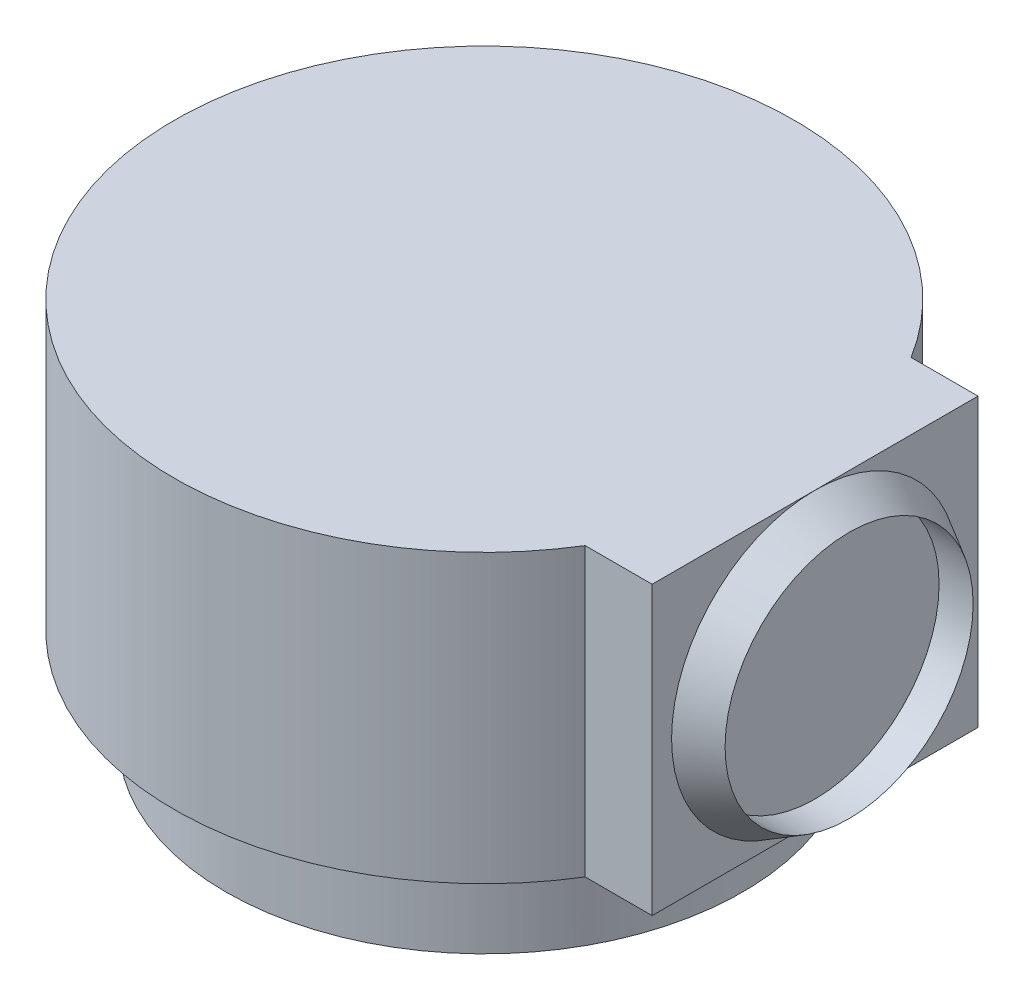
ISO-10303-21;
HEADER;
FILE_DESCRIPTION(('STEP AP214'),'2;1');
FILE_NAME('part.step','',(''),(''),'','','');
FILE_SCHEMA(('AUTOMOTIVE_DESIGN { 1 0 10303 214 1 1 1 1 }'));
ENDSEC;
DATA;
#1=APPLICATION_CONTEXT('core data for automotive mechanical design processes');
#2=APPLICATION_PROTOCOL_DEFINITION('international standard','automotive_design',2000,#1);
#3=PRODUCT_CONTEXT('',#1,'mechanical');
#4=PRODUCT('Part','Part','',(#3));
#5=PRODUCT_RELATED_PRODUCT_CATEGORY('part','',(#4));
#6=PRODUCT_DEFINITION_FORMATION('','',#4);
#7=PRODUCT_DEFINITION_CONTEXT('part definition',#1,'design');
#8=PRODUCT_DEFINITION('design','',#6,#7);
#9=PRODUCT_DEFINITION_SHAPE('','',#8);
#10=(LENGTH_UNIT() NAMED_UNIT(*) SI_UNIT(.MILLI.,.METRE.));
#11=(NAMED_UNIT(*) PLANE_ANGLE_UNIT() SI_UNIT($,.RADIAN.));
#12=(NAMED_UNIT(*) SI_UNIT($,.STERADIAN.) SOLID_ANGLE_UNIT());
#13=UNCERTAINTY_MEASURE_WITH_UNIT(LENGTH_MEASURE(1.E-05),#10,'distance_accuracy_value','');
#14=(GEOMETRIC_REPRESENTATION_CONTEXT(3) GLOBAL_UNCERTAINTY_ASSIGNED_CONTEXT((#13)) GLOBAL_UNIT_ASSIGNED_CONTEXT((#10,
#11,#12)) REPRESENTATION_CONTEXT('',''));
#15=CARTESIAN_POINT('',(0.,0.,0.));
#16=DIRECTION('',(0.,0.,1.));
#17=DIRECTION('',(1.,0.,0.));
#18=AXIS2_PLACEMENT_3D('',#15,#16,#17);
#19=CARTESIAN_POINT('',(170.,0.,0.));
#20=DIRECTION('',(1.,0.,0.));
#21=DIRECTION('',(0.,0.,-1.));
#22=AXIS2_PLACEMENT_3D('',#19,#20,#21);
#23=PLANE('',#22);
#24=DIRECTION('',(0.,0.,1.));
#25=VECTOR('',#24,1.);
#26=CARTESIAN_POINT('',(170.,147.5,-83.75));
#27=LINE('',#26,#25);
#28=CARTESIAN_POINT('',(170.,147.5,-83.75));
#29=VERTEX_POINT('',#28);
#30=CARTESIAN_POINT('',(170.,147.5,0.));
#31=VERTEX_POINT('',#30);
#32=EDGE_CURVE('E94',#29,#31,#27,.T.);
#33=ORIENTED_EDGE('',*,*,#32,.T.);
#34=CARTESIAN_POINT('',(170.,73.75,0.));
#35=DIRECTION('',(-1.,0.,0.));
#36=DIRECTION('',(0.,0.,1.));
#37=AXIS2_PLACEMENT_3D('',#34,#35,#36);
#38=CIRCLE('',#37,73.75);
#39=CARTESIAN_POINT('',(170.,0.,0.));
#40=VERTEX_POINT('',#39);
#41=EDGE_CURVE('E52',#31,#40,#38,.T.);
#42=ORIENTED_EDGE('',*,*,#41,.T.);
#43=DIRECTION('',(0.,0.,-1.));
#44=VECTOR('',#43,1.);
#45=CARTESIAN_POINT('',(170.,0.,83.75));
#46=LINE('',#45,#44);
#47=CARTESIAN_POINT('',(170.,0.,-83.75));
#48=VERTEX_POINT('',#47);
#49=EDGE_CURVE('E91',#40,#48,#46,.T.);
#50=ORIENTED_EDGE('',*,*,#49,.T.);
#51=DIRECTION('',(0.,1.,0.));
#52=VECTOR('',#51,1.);
#53=CARTESIAN_POINT('',(170.,0.,-83.75));
#54=LINE('',#53,#52);
#55=EDGE_CURVE('E111',#48,#29,#54,.T.);
#56=ORIENTED_EDGE('',*,*,#55,.T.);
#57=EDGE_LOOP('',(#33,#42,#50,#56));
#58=FACE_BOUND('',#57,.T.);
#59=ADVANCED_FACE('F38',(#58),#23,.T.);
#60=CARTESIAN_POINT('',(0.,147.5,0.));
#61=DIRECTION('',(0.,-1.,0.));
#62=DIRECTION('',(0.,0.,-1.));
#63=AXIS2_PLACEMENT_3D('',#60,#61,#62);
#64=CYLINDRICAL_SURFACE('',#63,159.375);
#65=DIRECTION('',(0.,-1.,0.));
#66=VECTOR('',#65,1.);
#67=CARTESIAN_POINT('',(135.596195097798,147.5,83.75));
#68=LINE('',#67,#66);
#69=CARTESIAN_POINT('',(135.596195097798,147.5,83.75));
#70=VERTEX_POINT('',#69);
#71=CARTESIAN_POINT('',(135.596195097798,0.,83.75));
#72=VERTEX_POINT('',#71);
#73=EDGE_CURVE('E60',#70,#72,#68,.T.);
#74=ORIENTED_EDGE('',*,*,#73,.F.);
#75=CARTESIAN_POINT('',(0.,147.5,0.));
#76=DIRECTION('',(0.,1.,0.));
#77=DIRECTION('',(0.,0.,1.));
#78=AXIS2_PLACEMENT_3D('',#75,#76,#77);
#79=CIRCLE('',#78,159.375);
#80=CARTESIAN_POINT('',(135.596195097798,147.5,-83.75));
#81=VERTEX_POINT('',#80);
#82=EDGE_CURVE('E130',#81,#70,#79,.T.);
#83=ORIENTED_EDGE('',*,*,#82,.F.);
#84=DIRECTION('',(0.,-1.,0.));
#85=VECTOR('',#84,1.);
#86=CARTESIAN_POINT('',(135.596195097798,147.5,-83.75));
#87=LINE('',#86,#85);
#88=CARTESIAN_POINT('',(135.596195097798,0.,-83.75));
#89=VERTEX_POINT('',#88);
#90=EDGE_CURVE('E125',#89,#81,#87,.F.);
#91=ORIENTED_EDGE('',*,*,#90,.F.);
#92=CARTESIAN_POINT('',(0.,0.,0.));
#93=DIRECTION('',(0.,1.,0.));
#94=DIRECTION('',(0.,0.,1.));
#95=AXIS2_PLACEMENT_3D('',#92,#93,#94);
#96=CIRCLE('',#95,159.375);
#97=EDGE_CURVE('E129',#89,#72,#96,.T.);
#98=ORIENTED_EDGE('',*,*,#97,.T.);
#99=EDGE_LOOP('',(#74,#83,#91,#98));
#100=FACE_BOUND('',#99,.T.);
#101=ADVANCED_FACE('F40',(#100),#64,.T.);
#102=CARTESIAN_POINT('',(0.,147.5,0.));
#103=DIRECTION('',(0.,1.,0.));
#104=DIRECTION('',(0.,0.,1.));
#105=AXIS2_PLACEMENT_3D('',#102,#103,#104);
#106=PLANE('',#105);
#107=ORIENTED_EDGE('',*,*,#82,.T.);
#108=DIRECTION('',(-1.,0.,0.));
#109=VECTOR('',#108,1.);
#110=CARTESIAN_POINT('',(170.,147.5,83.75));
#111=LINE('',#110,#109);
#112=CARTESIAN_POINT('',(170.,147.5,83.75));
#113=VERTEX_POINT('',#112);
#114=EDGE_CURVE('E122',#113,#70,#111,.T.);
#115=ORIENTED_EDGE('',*,*,#114,.F.);
#116=EDGE_CURVE('E95',#31,#113,#27,.T.);
#117=ORIENTED_EDGE('',*,*,#116,.F.);
#118=ORIENTED_EDGE('',*,*,#32,.F.);
#119=DIRECTION('',(-1.,0.,0.));
#120=VECTOR('',#119,1.);
#121=CARTESIAN_POINT('',(170.,147.5,-83.75));
#122=LINE('',#121,#120);
#123=EDGE_CURVE('E112',#29,#81,#122,.T.);
#124=ORIENTED_EDGE('',*,*,#123,.T.);
#125=EDGE_LOOP('',(#107,#115,#117,#118,#124));
#126=FACE_BOUND('',#125,.T.);
#127=ADVANCED_FACE('F135',(#126),#106,.T.);
#128=CARTESIAN_POINT('',(0.,0.,0.));
#129=DIRECTION('',(0.,1.,0.));
#130=DIRECTION('',(0.,0.,1.));
#131=AXIS2_PLACEMENT_3D('',#128,#129,#130);
#132=PLANE('',#131);
#133=CARTESIAN_POINT('',(0.,0.,0.));
#134=DIRECTION('',(0.,1.,0.));
#135=DIRECTION('',(0.,0.,1.));
#136=AXIS2_PLACEMENT_3D('',#133,#134,#135);
#137=CIRCLE('',#136,132.8125);
#138=CARTESIAN_POINT('',(0.,0.,132.8125));
#139=VERTEX_POINT('',#138);
#140=EDGE_CURVE('E11',#139,#139,#137,.F.);
#141=ORIENTED_EDGE('',*,*,#140,.F.);
#142=EDGE_LOOP('',(#141));
#143=FACE_BOUND('',#142,.T.);
#144=ORIENTED_EDGE('',*,*,#97,.F.);
#145=DIRECTION('',(-1.,0.,0.));
#146=VECTOR('',#145,1.);
#147=CARTESIAN_POINT('',(170.,0.,-83.75));
#148=LINE('',#147,#146);
#149=EDGE_CURVE('E104',#48,#89,#148,.T.);
#150=ORIENTED_EDGE('',*,*,#149,.F.);
#151=ORIENTED_EDGE('',*,*,#49,.F.);
#152=CARTESIAN_POINT('',(170.,0.,83.75));
#153=VERTEX_POINT('',#152);
#154=EDGE_CURVE('E102',#153,#40,#46,.T.);
#155=ORIENTED_EDGE('',*,*,#154,.F.);
#156=DIRECTION('',(-1.,0.,0.));
#157=VECTOR('',#156,1.);
#158=CARTESIAN_POINT('',(170.,0.,83.75));
#159=LINE('',#158,#157);
#160=EDGE_CURVE('E120',#153,#72,#159,.T.);
#161=ORIENTED_EDGE('',*,*,#160,.T.);
#162=EDGE_LOOP('',(#144,#150,#151,#155,#161));
#163=FACE_BOUND('',#162,.T.);
#164=ADVANCED_FACE('F100',(#143,#163),#132,.F.);
#165=CARTESIAN_POINT('',(170.,147.5,83.75));
#166=DIRECTION('',(0.,0.,-1.));
#167=DIRECTION('',(0.,1.,0.));
#168=AXIS2_PLACEMENT_3D('',#165,#166,#167);
#169=PLANE('',#168);
#170=ORIENTED_EDGE('',*,*,#114,.T.);
#171=ORIENTED_EDGE('',*,*,#73,.T.);
#172=ORIENTED_EDGE('',*,*,#160,.F.);
#173=DIRECTION('',(0.,-1.,0.));
#174=VECTOR('',#173,1.);
#175=CARTESIAN_POINT('',(170.,147.5,83.75));
#176=LINE('',#175,#174);
#177=EDGE_CURVE('E106',#113,#153,#176,.T.);
#178=ORIENTED_EDGE('',*,*,#177,.F.);
#179=EDGE_LOOP('',(#170,#171,#172,#178));
#180=FACE_BOUND('',#179,.T.);
#181=ADVANCED_FACE('F132',(#180),#169,.F.);
#182=CARTESIAN_POINT('',(170.,0.,-83.75));
#183=DIRECTION('',(0.,0.,1.));
#184=DIRECTION('',(1.,0.,0.));
#185=AXIS2_PLACEMENT_3D('',#182,#183,#184);
#186=PLANE('',#185);
#187=ORIENTED_EDGE('',*,*,#149,.T.);
#188=ORIENTED_EDGE('',*,*,#90,.T.);
#189=ORIENTED_EDGE('',*,*,#123,.F.);
#190=ORIENTED_EDGE('',*,*,#55,.F.);
#191=EDGE_LOOP('',(#187,#188,#189,#190));
#192=FACE_BOUND('',#191,.T.);
#193=ADVANCED_FACE('F138',(#192),#186,.F.);
#194=ORIENTED_EDGE('',*,*,#154,.T.);
#195=EDGE_CURVE('E46',#40,#31,#38,.T.);
#196=ORIENTED_EDGE('',*,*,#195,.T.);
#197=ORIENTED_EDGE('',*,*,#116,.T.);
#198=ORIENTED_EDGE('',*,*,#177,.T.);
#199=EDGE_LOOP('',(#194,#196,#197,#198));
#200=FACE_BOUND('',#199,.T.);
#201=ADVANCED_FACE('F108',(#200),#23,.T.);
#202=CARTESIAN_POINT('',(170.,73.75,0.));
#203=DIRECTION('',(-1.,0.,0.));
#204=DIRECTION('',(0.,0.,1.));
#205=AXIS2_PLACEMENT_3D('',#202,#203,#204);
#206=CONICAL_SURFACE('',#205,73.75,0.519146114246523);
#207=CARTESIAN_POINT('',(187.5,73.75,0.));
#208=DIRECTION('',(-1.,0.,0.));
#209=DIRECTION('',(0.,0.,1.));
#210=AXIS2_PLACEMENT_3D('',#207,#208,#209);
#211=CIRCLE('',#210,63.75);
#212=CARTESIAN_POINT('',(187.5,73.75,63.75));
#213=VERTEX_POINT('',#212);
#214=EDGE_CURVE('E96',#213,#213,#211,.T.);
#215=ORIENTED_EDGE('',*,*,#214,.T.);
#216=EDGE_LOOP('',(#215));
#217=FACE_BOUND('',#216,.T.);
#218=ORIENTED_EDGE('',*,*,#41,.F.);
#219=ORIENTED_EDGE('',*,*,#195,.F.);
#220=EDGE_LOOP('',(#218,#219));
#221=FACE_BOUND('',#220,.T.);
#222=ADVANCED_FACE('F82',(#217,#221),#206,.T.);
#223=CARTESIAN_POINT('',(170.,73.75,0.));
#224=DIRECTION('',(-1.,0.,0.));
#225=DIRECTION('',(0.,0.,1.));
#226=AXIS2_PLACEMENT_3D('',#223,#224,#225);
#227=CYLINDRICAL_SURFACE('',#226,63.75);
#228=CARTESIAN_POINT('',(170.,73.75,0.));
#229=DIRECTION('',(-1.,0.,0.));
#230=DIRECTION('',(0.,0.,1.));
#231=AXIS2_PLACEMENT_3D('',#228,#229,#230);
#232=CIRCLE('',#231,63.75);
#233=CARTESIAN_POINT('',(170.,73.75,63.75));
#234=VERTEX_POINT('',#233);
#235=EDGE_CURVE('E86',#234,#234,#232,.T.);
#236=ORIENTED_EDGE('',*,*,#235,.T.);
#237=EDGE_LOOP('',(#236));
#238=FACE_BOUND('',#237,.T.);
#239=ORIENTED_EDGE('',*,*,#214,.F.);
#240=EDGE_LOOP('',(#239));
#241=FACE_BOUND('',#240,.T.);
#242=ADVANCED_FACE('F174',(#238,#241),#227,.F.);
#243=ORIENTED_EDGE('',*,*,#235,.F.);
#244=EDGE_LOOP('',(#243));
#245=FACE_BOUND('',#244,.T.);
#246=ADVANCED_FACE('F153',(#245),#23,.T.);
#247=CARTESIAN_POINT('',(0.,-50.,0.));
#248=DIRECTION('',(0.,1.,0.));
#249=DIRECTION('',(0.,0.,1.));
#250=AXIS2_PLACEMENT_3D('',#247,#248,#249);
#251=CYLINDRICAL_SURFACE('',#250,132.8125);
#252=CARTESIAN_POINT('',(0.,-50.,0.));
#253=DIRECTION('',(0.,-1.,0.));
#254=DIRECTION('',(0.,0.,-1.));
#255=AXIS2_PLACEMENT_3D('',#252,#253,#254);
#256=CIRCLE('',#255,132.8125);
#257=CARTESIAN_POINT('',(0.,-50.,-132.8125));
#258=VERTEX_POINT('',#257);
#259=EDGE_CURVE('E144',#258,#258,#256,.T.);
#260=ORIENTED_EDGE('',*,*,#259,.F.);
#261=EDGE_LOOP('',(#260));
#262=FACE_BOUND('',#261,.T.);
#263=ORIENTED_EDGE('',*,*,#140,.T.);
#264=EDGE_LOOP('',(#263));
#265=FACE_BOUND('',#264,.T.);
#266=ADVANCED_FACE('F150',(#262,#265),#251,.T.);
#267=CARTESIAN_POINT('',(0.,-50.,0.));
#268=DIRECTION('',(0.,-1.,0.));
#269=DIRECTION('',(0.,0.,-1.));
#270=AXIS2_PLACEMENT_3D('',#267,#268,#269);
#271=PLANE('',#270);
#272=ORIENTED_EDGE('',*,*,#259,.T.);
#273=EDGE_LOOP('',(#272));
#274=FACE_BOUND('',#273,.T.);
#275=ADVANCED_FACE('F148',(#274),#271,.T.);
#276=CLOSED_SHELL('',(#59,#101,#127,#164,#181,#193,#201,#222,#242,#246,#266,#275));
#277=MANIFOLD_SOLID_BREP('B2',#276);
#278=ADVANCED_BREP_SHAPE_REPRESENTATION('',(#18,#277),#14);
#279=SHAPE_DEFINITION_REPRESENTATION(#9,#278);
ENDSEC;
END-ISO-10303-21;
